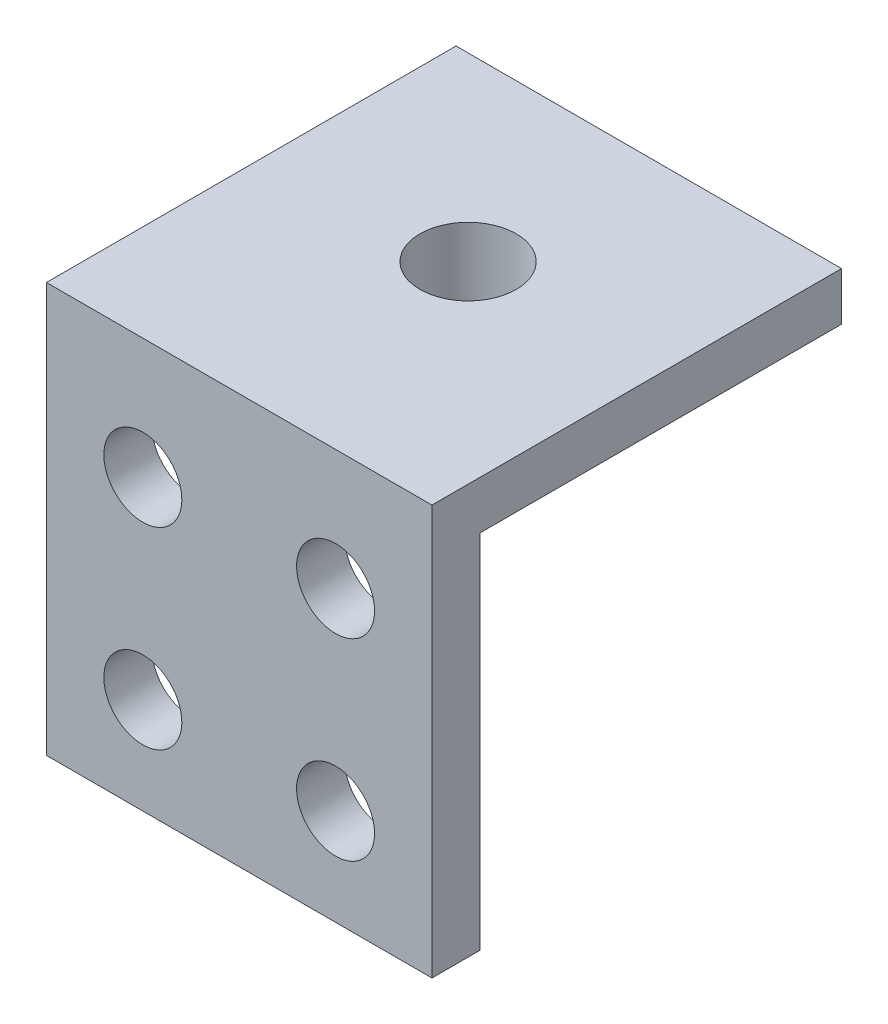
ISO-10303-21;
HEADER;
FILE_DESCRIPTION(('STEP AP214'),'2;1');
FILE_NAME('part.step','',(''),(''),'','','');
FILE_SCHEMA(('AUTOMOTIVE_DESIGN { 1 0 10303 214 1 1 1 1 }'));
ENDSEC;
DATA;
#1=APPLICATION_CONTEXT('core data for automotive mechanical design processes');
#2=APPLICATION_PROTOCOL_DEFINITION('international standard','automotive_design',2000,#1);
#3=PRODUCT_CONTEXT('',#1,'mechanical');
#4=PRODUCT('Part','Part','',(#3));
#5=PRODUCT_RELATED_PRODUCT_CATEGORY('part','',(#4));
#6=PRODUCT_DEFINITION_FORMATION('','',#4);
#7=PRODUCT_DEFINITION_CONTEXT('part definition',#1,'design');
#8=PRODUCT_DEFINITION('design','',#6,#7);
#9=PRODUCT_DEFINITION_SHAPE('','',#8);
#10=(LENGTH_UNIT() NAMED_UNIT(*) SI_UNIT(.MILLI.,.METRE.));
#11=(NAMED_UNIT(*) PLANE_ANGLE_UNIT() SI_UNIT($,.RADIAN.));
#12=(NAMED_UNIT(*) SI_UNIT($,.STERADIAN.) SOLID_ANGLE_UNIT());
#13=UNCERTAINTY_MEASURE_WITH_UNIT(LENGTH_MEASURE(1.E-05),#10,'distance_accuracy_value','');
#14=(GEOMETRIC_REPRESENTATION_CONTEXT(3) GLOBAL_UNCERTAINTY_ASSIGNED_CONTEXT((#13)) GLOBAL_UNIT_ASSIGNED_CONTEXT((#10,
#11,#12)) REPRESENTATION_CONTEXT('',''));
#15=CARTESIAN_POINT('',(0.,0.,0.));
#16=DIRECTION('',(0.,0.,1.));
#17=DIRECTION('',(1.,0.,0.));
#18=AXIS2_PLACEMENT_3D('',#15,#16,#17);
#19=CARTESIAN_POINT('',(-12.7,-1.5875,-1.5875));
#20=DIRECTION('',(0.,-1.,0.));
#21=DIRECTION('',(1.,0.,0.));
#22=AXIS2_PLACEMENT_3D('',#19,#20,#21);
#23=PLANE('',#22);
#24=DIRECTION('',(0.,0.,-1.));
#25=VECTOR('',#24,1.);
#26=CARTESIAN_POINT('',(-12.7,-1.5875,-1.5875));
#27=LINE('',#26,#25);
#28=CARTESIAN_POINT('',(-12.7,-1.5875,-1.5875));
#29=VERTEX_POINT('',#28);
#30=CARTESIAN_POINT('',(-12.7,-1.5875,-25.4));
#31=VERTEX_POINT('',#30);
#32=EDGE_CURVE('E196',#29,#31,#27,.T.);
#33=ORIENTED_EDGE('',*,*,#32,.T.);
#34=DIRECTION('',(1.,0.,0.));
#35=VECTOR('',#34,1.);
#36=CARTESIAN_POINT('',(-12.7,-1.5875,-25.4));
#37=LINE('',#36,#35);
#38=CARTESIAN_POINT('',(12.7,-1.5875,-25.4));
#39=VERTEX_POINT('',#38);
#40=EDGE_CURVE('E12',#31,#39,#37,.T.);
#41=ORIENTED_EDGE('',*,*,#40,.T.);
#42=DIRECTION('',(0.,0.,-1.));
#43=VECTOR('',#42,1.);
#44=CARTESIAN_POINT('',(12.7,-1.5875,-1.5875));
#45=LINE('',#44,#43);
#46=CARTESIAN_POINT('',(12.7,-1.5875,-1.5875));
#47=VERTEX_POINT('',#46);
#48=EDGE_CURVE('E199',#47,#39,#45,.T.);
#49=ORIENTED_EDGE('',*,*,#48,.F.);
#50=DIRECTION('',(-1.,0.,0.));
#51=VECTOR('',#50,1.);
#52=CARTESIAN_POINT('',(-12.7,-1.5875,-1.5875));
#53=LINE('',#52,#51);
#54=EDGE_CURVE('E171',#47,#29,#53,.T.);
#55=ORIENTED_EDGE('',*,*,#54,.T.);
#56=EDGE_LOOP('',(#33,#41,#49,#55));
#57=FACE_BOUND('',#56,.T.);
#58=DIRECTION('',(0.707106781186547,0.,0.707106781186548));
#59=VECTOR('',#58,1.);
#60=CARTESIAN_POINT('',(2.63025612106916,-1.5875,-19.84375));
#61=LINE('',#60,#59);
#62=CARTESIAN_POINT('',(2.63025612106916,-1.5875,-19.84375));
#63=VERTEX_POINT('',#62);
#64=CARTESIAN_POINT('',(6.35,-1.5875,-16.1240061210692));
#65=VERTEX_POINT('',#64);
#66=EDGE_CURVE('E479',#63,#65,#61,.T.);
#67=ORIENTED_EDGE('',*,*,#66,.F.);
#68=DIRECTION('',(1.,0.,0.));
#69=VECTOR('',#68,1.);
#70=CARTESIAN_POINT('',(-2.63025612106915,-1.5875,-19.84375));
#71=LINE('',#70,#69);
#72=CARTESIAN_POINT('',(-2.63025612106915,-1.5875,-19.84375));
#73=VERTEX_POINT('',#72);
#74=EDGE_CURVE('E155',#73,#63,#71,.T.);
#75=ORIENTED_EDGE('',*,*,#74,.F.);
#76=DIRECTION('',(0.707106781186548,0.,-0.707106781186548));
#77=VECTOR('',#76,1.);
#78=CARTESIAN_POINT('',(-6.35,-1.5875,-16.1240061210692));
#79=LINE('',#78,#77);
#80=CARTESIAN_POINT('',(-6.35,-1.5875,-16.1240061210692));
#81=VERTEX_POINT('',#80);
#82=EDGE_CURVE('E151',#81,#73,#79,.T.);
#83=ORIENTED_EDGE('',*,*,#82,.F.);
#84=DIRECTION('',(0.,0.,-1.));
#85=VECTOR('',#84,1.);
#86=CARTESIAN_POINT('',(-6.35,-1.5875,-10.8634938789308));
#87=LINE('',#86,#85);
#88=CARTESIAN_POINT('',(-6.35,-1.5875,-10.8634938789308));
#89=VERTEX_POINT('',#88);
#90=EDGE_CURVE('E489',#89,#81,#87,.T.);
#91=ORIENTED_EDGE('',*,*,#90,.F.);
#92=DIRECTION('',(-0.707106781186547,0.,-0.707106781186548));
#93=VECTOR('',#92,1.);
#94=CARTESIAN_POINT('',(-2.63025612106916,-1.5875,-7.14375));
#95=LINE('',#94,#93);
#96=CARTESIAN_POINT('',(-2.63025612106916,-1.5875,-7.14375));
#97=VERTEX_POINT('',#96);
#98=EDGE_CURVE('E487',#97,#89,#95,.T.);
#99=ORIENTED_EDGE('',*,*,#98,.F.);
#100=DIRECTION('',(-1.,0.,0.));
#101=VECTOR('',#100,1.);
#102=CARTESIAN_POINT('',(2.63025612106914,-1.5875,-7.14374999999999));
#103=LINE('',#102,#101);
#104=CARTESIAN_POINT('',(2.63025612106914,-1.5875,-7.14374999999999));
#105=VERTEX_POINT('',#104);
#106=EDGE_CURVE('E485',#105,#97,#103,.T.);
#107=ORIENTED_EDGE('',*,*,#106,.F.);
#108=DIRECTION('',(-0.707106781186548,0.,0.707106781186547));
#109=VECTOR('',#108,1.);
#110=CARTESIAN_POINT('',(6.35,-1.5875,-10.8634938789308));
#111=LINE('',#110,#109);
#112=CARTESIAN_POINT('',(6.35,-1.5875,-10.8634938789308));
#113=VERTEX_POINT('',#112);
#114=EDGE_CURVE('E483',#113,#105,#111,.T.);
#115=ORIENTED_EDGE('',*,*,#114,.F.);
#116=DIRECTION('',(0.,0.,1.));
#117=VECTOR('',#116,1.);
#118=CARTESIAN_POINT('',(6.35,-1.5875,-16.1240061210692));
#119=LINE('',#118,#117);
#120=EDGE_CURVE('E481',#65,#113,#119,.T.);
#121=ORIENTED_EDGE('',*,*,#120,.F.);
#122=EDGE_LOOP('',(#67,#75,#83,#91,#99,#107,#115,#121));
#123=FACE_BOUND('',#122,.T.);
#124=ADVANCED_FACE('F32',(#57,#123),#23,.T.);
#125=CARTESIAN_POINT('',(-12.7,1.58750000000001,1.5875));
#126=DIRECTION('',(0.,1.,0.));
#127=DIRECTION('',(-1.,0.,0.));
#128=AXIS2_PLACEMENT_3D('',#125,#126,#127);
#129=PLANE('',#128);
#130=CARTESIAN_POINT('',(0.,1.58750000000001,-13.49375));
#131=DIRECTION('',(0.,-1.,0.));
#132=DIRECTION('',(1.,0.,0.));
#133=AXIS2_PLACEMENT_3D('',#130,#131,#132);
#134=CIRCLE('',#133,3.175);
#135=CARTESIAN_POINT('',(3.175,1.58750000000001,-13.49375));
#136=VERTEX_POINT('',#135);
#137=EDGE_CURVE('E463',#136,#136,#134,.T.);
#138=ORIENTED_EDGE('',*,*,#137,.T.);
#139=EDGE_LOOP('',(#138));
#140=FACE_BOUND('',#139,.T.);
#141=DIRECTION('',(0.,0.,-1.));
#142=VECTOR('',#141,1.);
#143=CARTESIAN_POINT('',(12.7,1.5875,1.5875));
#144=LINE('',#143,#142);
#145=CARTESIAN_POINT('',(12.7,1.5875,1.5875));
#146=VERTEX_POINT('',#145);
#147=CARTESIAN_POINT('',(12.7,1.5875,-25.4));
#148=VERTEX_POINT('',#147);
#149=EDGE_CURVE('E201',#146,#148,#144,.T.);
#150=ORIENTED_EDGE('',*,*,#149,.T.);
#151=DIRECTION('',(-1.,0.,0.));
#152=VECTOR('',#151,1.);
#153=CARTESIAN_POINT('',(-12.7,1.58750000000001,-25.4));
#154=LINE('',#153,#152);
#155=CARTESIAN_POINT('',(-12.7,1.58750000000001,-25.4));
#156=VERTEX_POINT('',#155);
#157=EDGE_CURVE('E168',#148,#156,#154,.T.);
#158=ORIENTED_EDGE('',*,*,#157,.T.);
#159=DIRECTION('',(0.,0.,-1.));
#160=VECTOR('',#159,1.);
#161=CARTESIAN_POINT('',(-12.7,1.58750000000001,1.58750000000001));
#162=LINE('',#161,#160);
#163=CARTESIAN_POINT('',(-12.7,1.58750000000001,1.58750000000001));
#164=VERTEX_POINT('',#163);
#165=EDGE_CURVE('E177',#164,#156,#162,.T.);
#166=ORIENTED_EDGE('',*,*,#165,.F.);
#167=DIRECTION('',(1.,0.,0.));
#168=VECTOR('',#167,1.);
#169=CARTESIAN_POINT('',(-12.7,1.58750000000001,1.5875));
#170=LINE('',#169,#168);
#171=EDGE_CURVE('E174',#164,#146,#170,.T.);
#172=ORIENTED_EDGE('',*,*,#171,.T.);
#173=EDGE_LOOP('',(#150,#158,#166,#172));
#174=FACE_BOUND('',#173,.T.);
#175=ADVANCED_FACE('F220',(#140,#174),#129,.T.);
#176=CARTESIAN_POINT('',(-12.7,25.5976683508479,1.58750000000001));
#177=DIRECTION('',(0.,0.,-1.));
#178=DIRECTION('',(0.,1.,0.));
#179=AXIS2_PLACEMENT_3D('',#176,#177,#178);
#180=PLANE('',#179);
#181=CARTESIAN_POINT('',(-6.35,-6.35,1.58750000000001));
#182=DIRECTION('',(0.,0.,-1.));
#183=DIRECTION('',(0.,1.,0.));
#184=AXIS2_PLACEMENT_3D('',#181,#182,#183);
#185=CIRCLE('',#184,2.56951014505216);
#186=CARTESIAN_POINT('',(-6.35,-3.78048985494783,1.58750000000001));
#187=VERTEX_POINT('',#186);
#188=EDGE_CURVE('E437',#187,#187,#185,.T.);
#189=ORIENTED_EDGE('',*,*,#188,.T.);
#190=EDGE_LOOP('',(#189));
#191=FACE_BOUND('',#190,.T.);
#192=CARTESIAN_POINT('',(-6.35,-19.05,1.58750000000001));
#193=DIRECTION('',(0.,0.,-1.));
#194=DIRECTION('',(0.,1.,0.));
#195=AXIS2_PLACEMENT_3D('',#192,#193,#194);
#196=CIRCLE('',#195,2.56951014505216);
#197=CARTESIAN_POINT('',(-6.35,-16.4804898549478,1.58750000000001));
#198=VERTEX_POINT('',#197);
#199=EDGE_CURVE('E445',#198,#198,#196,.T.);
#200=ORIENTED_EDGE('',*,*,#199,.T.);
#201=EDGE_LOOP('',(#200));
#202=FACE_BOUND('',#201,.T.);
#203=CARTESIAN_POINT('',(6.35,-6.35,1.58750000000001));
#204=DIRECTION('',(0.,0.,-1.));
#205=DIRECTION('',(0.,1.,0.));
#206=AXIS2_PLACEMENT_3D('',#203,#204,#205);
#207=CIRCLE('',#206,2.56951014505216);
#208=CARTESIAN_POINT('',(6.35,-3.78048985494783,1.58750000000001));
#209=VERTEX_POINT('',#208);
#210=EDGE_CURVE('E451',#209,#209,#207,.T.);
#211=ORIENTED_EDGE('',*,*,#210,.T.);
#212=EDGE_LOOP('',(#211));
#213=FACE_BOUND('',#212,.T.);
#214=CARTESIAN_POINT('',(6.35,-19.05,1.58750000000001));
#215=DIRECTION('',(0.,0.,-1.));
#216=DIRECTION('',(0.,1.,0.));
#217=AXIS2_PLACEMENT_3D('',#214,#215,#216);
#218=CIRCLE('',#217,2.56951014505216);
#219=CARTESIAN_POINT('',(6.35,-16.4804898549478,1.58750000000001));
#220=VERTEX_POINT('',#219);
#221=EDGE_CURVE('E457',#220,#220,#218,.T.);
#222=ORIENTED_EDGE('',*,*,#221,.T.);
#223=EDGE_LOOP('',(#222));
#224=FACE_BOUND('',#223,.T.);
#225=ORIENTED_EDGE('',*,*,#171,.F.);
#226=DIRECTION('',(0.,-1.,0.));
#227=VECTOR('',#226,1.);
#228=CARTESIAN_POINT('',(-12.7,25.5976683508479,1.58750000000001));
#229=LINE('',#228,#227);
#230=CARTESIAN_POINT('',(-12.7,-25.4,1.5875));
#231=VERTEX_POINT('',#230);
#232=EDGE_CURVE('E189',#164,#231,#229,.T.);
#233=ORIENTED_EDGE('',*,*,#232,.T.);
#234=DIRECTION('',(1.,0.,0.));
#235=VECTOR('',#234,1.);
#236=CARTESIAN_POINT('',(-12.7,-25.4,1.5875));
#237=LINE('',#236,#235);
#238=CARTESIAN_POINT('',(12.7,-25.4,1.5875));
#239=VERTEX_POINT('',#238);
#240=EDGE_CURVE('E184',#231,#239,#237,.T.);
#241=ORIENTED_EDGE('',*,*,#240,.T.);
#242=DIRECTION('',(0.,-1.,0.));
#243=VECTOR('',#242,1.);
#244=CARTESIAN_POINT('',(12.7,25.5976683508479,1.58750000000001));
#245=LINE('',#244,#243);
#246=EDGE_CURVE('E187',#146,#239,#245,.T.);
#247=ORIENTED_EDGE('',*,*,#246,.F.);
#248=EDGE_LOOP('',(#225,#233,#241,#247));
#249=FACE_BOUND('',#248,.T.);
#250=ADVANCED_FACE('F224',(#191,#202,#213,#224,#249),#180,.F.);
#251=CARTESIAN_POINT('',(-12.7,25.5976683508479,1.58750000000001));
#252=DIRECTION('',(1.,0.,0.));
#253=DIRECTION('',(0.,0.,-1.));
#254=AXIS2_PLACEMENT_3D('',#251,#252,#253);
#255=PLANE('',#254);
#256=ORIENTED_EDGE('',*,*,#232,.F.);
#257=ORIENTED_EDGE('',*,*,#165,.T.);
#258=DIRECTION('',(0.,-1.,0.));
#259=VECTOR('',#258,1.);
#260=CARTESIAN_POINT('',(-12.7,13.592584175424,-25.4));
#261=LINE('',#260,#259);
#262=EDGE_CURVE('E40',#156,#31,#261,.T.);
#263=ORIENTED_EDGE('',*,*,#262,.T.);
#264=ORIENTED_EDGE('',*,*,#32,.F.);
#265=DIRECTION('',(0.,-1.,0.));
#266=VECTOR('',#265,1.);
#267=CARTESIAN_POINT('',(-12.7,25.5976683508479,-1.58749999999999));
#268=LINE('',#267,#266);
#269=CARTESIAN_POINT('',(-12.7,-25.4,-1.5875));
#270=VERTEX_POINT('',#269);
#271=EDGE_CURVE('E191',#29,#270,#268,.T.);
#272=ORIENTED_EDGE('',*,*,#271,.T.);
#273=DIRECTION('',(0.,0.,1.));
#274=VECTOR('',#273,1.);
#275=CARTESIAN_POINT('',(-12.7,-25.4,1.5875));
#276=LINE('',#275,#274);
#277=EDGE_CURVE('E181',#270,#231,#276,.T.);
#278=ORIENTED_EDGE('',*,*,#277,.T.);
#279=EDGE_LOOP('',(#256,#257,#263,#264,#272,#278));
#280=FACE_BOUND('',#279,.T.);
#281=ADVANCED_FACE('F217',(#280),#255,.F.);
#282=CARTESIAN_POINT('',(-12.7,25.5976683508479,-1.58749999999999));
#283=DIRECTION('',(0.,0.,1.));
#284=DIRECTION('',(0.,-1.,0.));
#285=AXIS2_PLACEMENT_3D('',#282,#283,#284);
#286=PLANE('',#285);
#287=CARTESIAN_POINT('',(-6.35,-6.35,-1.5875));
#288=DIRECTION('',(0.,0.,-1.));
#289=DIRECTION('',(0.,1.,0.));
#290=AXIS2_PLACEMENT_3D('',#287,#288,#289);
#291=CIRCLE('',#290,2.56951014505216);
#292=CARTESIAN_POINT('',(-6.35,-3.78048985494783,-1.5875));
#293=VERTEX_POINT('',#292);
#294=EDGE_CURVE('E440',#293,#293,#291,.T.);
#295=ORIENTED_EDGE('',*,*,#294,.F.);
#296=EDGE_LOOP('',(#295));
#297=FACE_BOUND('',#296,.T.);
#298=CARTESIAN_POINT('',(-6.35,-19.05,-1.5875));
#299=DIRECTION('',(0.,0.,-1.));
#300=DIRECTION('',(0.,1.,0.));
#301=AXIS2_PLACEMENT_3D('',#298,#299,#300);
#302=CIRCLE('',#301,2.56951014505216);
#303=CARTESIAN_POINT('',(-6.35,-16.4804898549478,-1.5875));
#304=VERTEX_POINT('',#303);
#305=EDGE_CURVE('E442',#304,#304,#302,.T.);
#306=ORIENTED_EDGE('',*,*,#305,.F.);
#307=EDGE_LOOP('',(#306));
#308=FACE_BOUND('',#307,.T.);
#309=CARTESIAN_POINT('',(6.35,-6.35,-1.5875));
#310=DIRECTION('',(0.,0.,-1.));
#311=DIRECTION('',(0.,1.,0.));
#312=AXIS2_PLACEMENT_3D('',#309,#310,#311);
#313=CIRCLE('',#312,2.56951014505216);
#314=CARTESIAN_POINT('',(6.35,-3.78048985494783,-1.5875));
#315=VERTEX_POINT('',#314);
#316=EDGE_CURVE('E448',#315,#315,#313,.T.);
#317=ORIENTED_EDGE('',*,*,#316,.F.);
#318=EDGE_LOOP('',(#317));
#319=FACE_BOUND('',#318,.T.);
#320=CARTESIAN_POINT('',(6.35,-19.05,-1.5875));
#321=DIRECTION('',(0.,0.,-1.));
#322=DIRECTION('',(0.,1.,0.));
#323=AXIS2_PLACEMENT_3D('',#320,#321,#322);
#324=CIRCLE('',#323,2.56951014505216);
#325=CARTESIAN_POINT('',(6.35,-16.4804898549478,-1.5875));
#326=VERTEX_POINT('',#325);
#327=EDGE_CURVE('E454',#326,#326,#324,.T.);
#328=ORIENTED_EDGE('',*,*,#327,.F.);
#329=EDGE_LOOP('',(#328));
#330=FACE_BOUND('',#329,.T.);
#331=ORIENTED_EDGE('',*,*,#54,.F.);
#332=DIRECTION('',(0.,-1.,0.));
#333=VECTOR('',#332,1.);
#334=CARTESIAN_POINT('',(12.7,25.5976683508479,-1.5875));
#335=LINE('',#334,#333);
#336=CARTESIAN_POINT('',(12.7,-25.4,-1.5875));
#337=VERTEX_POINT('',#336);
#338=EDGE_CURVE('E175',#47,#337,#335,.T.);
#339=ORIENTED_EDGE('',*,*,#338,.T.);
#340=DIRECTION('',(-1.,0.,0.));
#341=VECTOR('',#340,1.);
#342=CARTESIAN_POINT('',(-12.7,-25.4,-1.5875));
#343=LINE('',#342,#341);
#344=EDGE_CURVE('E160',#337,#270,#343,.T.);
#345=ORIENTED_EDGE('',*,*,#344,.T.);
#346=ORIENTED_EDGE('',*,*,#271,.F.);
#347=EDGE_LOOP('',(#331,#339,#345,#346));
#348=FACE_BOUND('',#347,.T.);
#349=ADVANCED_FACE('F212',(#297,#308,#319,#330,#348),#286,.F.);
#350=CARTESIAN_POINT('',(12.7,25.5976683508479,1.58750000000001));
#351=DIRECTION('',(-1.,0.,0.));
#352=DIRECTION('',(0.,0.,1.));
#353=AXIS2_PLACEMENT_3D('',#350,#351,#352);
#354=PLANE('',#353);
#355=ORIENTED_EDGE('',*,*,#338,.F.);
#356=ORIENTED_EDGE('',*,*,#48,.T.);
#357=DIRECTION('',(0.,1.,0.));
#358=VECTOR('',#357,1.);
#359=CARTESIAN_POINT('',(12.7,13.592584175424,-25.4));
#360=LINE('',#359,#358);
#361=EDGE_CURVE('E35',#39,#148,#360,.T.);
#362=ORIENTED_EDGE('',*,*,#361,.T.);
#363=ORIENTED_EDGE('',*,*,#149,.F.);
#364=ORIENTED_EDGE('',*,*,#246,.T.);
#365=DIRECTION('',(0.,0.,-1.));
#366=VECTOR('',#365,1.);
#367=CARTESIAN_POINT('',(12.7,-25.4,1.5875));
#368=LINE('',#367,#366);
#369=EDGE_CURVE('E157',#239,#337,#368,.T.);
#370=ORIENTED_EDGE('',*,*,#369,.T.);
#371=EDGE_LOOP('',(#355,#356,#362,#363,#364,#370));
#372=FACE_BOUND('',#371,.T.);
#373=ADVANCED_FACE('F206',(#372),#354,.F.);
#374=CARTESIAN_POINT('',(12.7,-25.4,-1.5875));
#375=DIRECTION('',(0.,-1.,0.));
#376=DIRECTION('',(0.,0.,-1.));
#377=AXIS2_PLACEMENT_3D('',#374,#375,#376);
#378=PLANE('',#377);
#379=ORIENTED_EDGE('',*,*,#369,.F.);
#380=ORIENTED_EDGE('',*,*,#240,.F.);
#381=ORIENTED_EDGE('',*,*,#277,.F.);
#382=ORIENTED_EDGE('',*,*,#344,.F.);
#383=EDGE_LOOP('',(#379,#380,#381,#382));
#384=FACE_BOUND('',#383,.T.);
#385=ADVANCED_FACE('F227',(#384),#378,.T.);
#386=CARTESIAN_POINT('',(0.,0.,-25.4));
#387=DIRECTION('',(0.,0.,-1.));
#388=DIRECTION('',(-1.,0.,0.));
#389=AXIS2_PLACEMENT_3D('',#386,#387,#388);
#390=PLANE('',#389);
#391=ORIENTED_EDGE('',*,*,#361,.F.);
#392=ORIENTED_EDGE('',*,*,#40,.F.);
#393=ORIENTED_EDGE('',*,*,#262,.F.);
#394=ORIENTED_EDGE('',*,*,#157,.F.);
#395=EDGE_LOOP('',(#391,#392,#393,#394));
#396=FACE_BOUND('',#395,.T.);
#397=ADVANCED_FACE('F219',(#396),#390,.T.);
#398=CARTESIAN_POINT('',(-2.63025612106915,-7.9375,-19.84375));
#399=DIRECTION('',(0.,0.,1.));
#400=DIRECTION('',(1.,0.,0.));
#401=AXIS2_PLACEMENT_3D('',#398,#399,#400);
#402=PLANE('',#401);
#403=ORIENTED_EDGE('',*,*,#74,.T.);
#404=DIRECTION('',(0.,1.,0.));
#405=VECTOR('',#404,1.);
#406=CARTESIAN_POINT('',(2.63025612106916,-7.9375,-19.84375));
#407=LINE('',#406,#405);
#408=CARTESIAN_POINT('',(2.63025612106916,-7.9375,-19.84375));
#409=VERTEX_POINT('',#408);
#410=EDGE_CURVE('E136',#409,#63,#407,.T.);
#411=ORIENTED_EDGE('',*,*,#410,.F.);
#412=DIRECTION('',(1.,0.,0.));
#413=VECTOR('',#412,1.);
#414=CARTESIAN_POINT('',(-2.63025612106915,-7.9375,-19.84375));
#415=LINE('',#414,#413);
#416=CARTESIAN_POINT('',(-2.63025612106915,-7.9375,-19.84375));
#417=VERTEX_POINT('',#416);
#418=EDGE_CURVE('E143',#417,#409,#415,.T.);
#419=ORIENTED_EDGE('',*,*,#418,.F.);
#420=DIRECTION('',(0.,1.,0.));
#421=VECTOR('',#420,1.);
#422=CARTESIAN_POINT('',(-2.63025612106915,-7.9375,-19.84375));
#423=LINE('',#422,#421);
#424=EDGE_CURVE('E477',#417,#73,#423,.T.);
#425=ORIENTED_EDGE('',*,*,#424,.T.);
#426=EDGE_LOOP('',(#403,#411,#419,#425));
#427=FACE_BOUND('',#426,.T.);
#428=ADVANCED_FACE('F153',(#427),#402,.F.);
#429=CARTESIAN_POINT('',(2.63025612106916,-7.9375,-19.84375));
#430=DIRECTION('',(-0.707106781186548,0.,0.707106781186547));
#431=DIRECTION('',(0.707106781186547,0.,0.707106781186548));
#432=AXIS2_PLACEMENT_3D('',#429,#430,#431);
#433=PLANE('',#432);
#434=ORIENTED_EDGE('',*,*,#66,.T.);
#435=DIRECTION('',(0.,1.,0.));
#436=VECTOR('',#435,1.);
#437=CARTESIAN_POINT('',(6.35,-7.9375,-16.1240061210692));
#438=LINE('',#437,#436);
#439=CARTESIAN_POINT('',(6.35,-7.9375,-16.1240061210692));
#440=VERTEX_POINT('',#439);
#441=EDGE_CURVE('E139',#440,#65,#438,.T.);
#442=ORIENTED_EDGE('',*,*,#441,.F.);
#443=DIRECTION('',(0.707106781186547,0.,0.707106781186548));
#444=VECTOR('',#443,1.);
#445=CARTESIAN_POINT('',(2.63025612106916,-7.9375,-19.84375));
#446=LINE('',#445,#444);
#447=EDGE_CURVE('E132',#409,#440,#446,.T.);
#448=ORIENTED_EDGE('',*,*,#447,.F.);
#449=ORIENTED_EDGE('',*,*,#410,.T.);
#450=EDGE_LOOP('',(#434,#442,#448,#449));
#451=FACE_BOUND('',#450,.T.);
#452=ADVANCED_FACE('F134',(#451),#433,.F.);
#453=CARTESIAN_POINT('',(6.35,-7.9375,-16.1240061210692));
#454=DIRECTION('',(-1.,0.,0.));
#455=DIRECTION('',(0.,0.,1.));
#456=AXIS2_PLACEMENT_3D('',#453,#454,#455);
#457=PLANE('',#456);
#458=ORIENTED_EDGE('',*,*,#120,.T.);
#459=DIRECTION('',(0.,1.,0.));
#460=VECTOR('',#459,1.);
#461=CARTESIAN_POINT('',(6.35,-7.9375,-10.8634938789308));
#462=LINE('',#461,#460);
#463=CARTESIAN_POINT('',(6.35,-7.9375,-10.8634938789308));
#464=VERTEX_POINT('',#463);
#465=EDGE_CURVE('E162',#464,#113,#462,.T.);
#466=ORIENTED_EDGE('',*,*,#465,.F.);
#467=DIRECTION('',(0.,0.,1.));
#468=VECTOR('',#467,1.);
#469=CARTESIAN_POINT('',(6.35,-7.9375,-16.1240061210692));
#470=LINE('',#469,#468);
#471=EDGE_CURVE('E142',#440,#464,#470,.T.);
#472=ORIENTED_EDGE('',*,*,#471,.F.);
#473=ORIENTED_EDGE('',*,*,#441,.T.);
#474=EDGE_LOOP('',(#458,#466,#472,#473));
#475=FACE_BOUND('',#474,.T.);
#476=ADVANCED_FACE('F297',(#475),#457,.F.);
#477=CARTESIAN_POINT('',(6.35,-7.9375,-10.8634938789308));
#478=DIRECTION('',(-0.707106781186547,0.,-0.707106781186548));
#479=DIRECTION('',(-0.707106781186548,0.,0.707106781186547));
#480=AXIS2_PLACEMENT_3D('',#477,#478,#479);
#481=PLANE('',#480);
#482=ORIENTED_EDGE('',*,*,#114,.T.);
#483=DIRECTION('',(0.,1.,0.));
#484=VECTOR('',#483,1.);
#485=CARTESIAN_POINT('',(2.63025612106914,-7.9375,-7.14374999999999));
#486=LINE('',#485,#484);
#487=CARTESIAN_POINT('',(2.63025612106914,-7.9375,-7.14374999999999));
#488=VERTEX_POINT('',#487);
#489=EDGE_CURVE('E500',#488,#105,#486,.T.);
#490=ORIENTED_EDGE('',*,*,#489,.F.);
#491=DIRECTION('',(-0.707106781186548,0.,0.707106781186547));
#492=VECTOR('',#491,1.);
#493=CARTESIAN_POINT('',(6.35,-7.9375,-10.8634938789308));
#494=LINE('',#493,#492);
#495=EDGE_CURVE('E468',#464,#488,#494,.T.);
#496=ORIENTED_EDGE('',*,*,#495,.F.);
#497=ORIENTED_EDGE('',*,*,#465,.T.);
#498=EDGE_LOOP('',(#482,#490,#496,#497));
#499=FACE_BOUND('',#498,.T.);
#500=ADVANCED_FACE('F306',(#499),#481,.F.);
#501=CARTESIAN_POINT('',(2.63025612106914,-7.9375,-7.14374999999999));
#502=DIRECTION('',(0.,0.,-1.));
#503=DIRECTION('',(-1.,0.,0.));
#504=AXIS2_PLACEMENT_3D('',#501,#502,#503);
#505=PLANE('',#504);
#506=ORIENTED_EDGE('',*,*,#106,.T.);
#507=DIRECTION('',(0.,1.,0.));
#508=VECTOR('',#507,1.);
#509=CARTESIAN_POINT('',(-2.63025612106916,-7.9375,-7.14375));
#510=LINE('',#509,#508);
#511=CARTESIAN_POINT('',(-2.63025612106916,-7.9375,-7.14375));
#512=VERTEX_POINT('',#511);
#513=EDGE_CURVE('E497',#512,#97,#510,.T.);
#514=ORIENTED_EDGE('',*,*,#513,.F.);
#515=DIRECTION('',(-1.,0.,0.));
#516=VECTOR('',#515,1.);
#517=CARTESIAN_POINT('',(2.63025612106914,-7.9375,-7.14374999999999));
#518=LINE('',#517,#516);
#519=EDGE_CURVE('E470',#488,#512,#518,.T.);
#520=ORIENTED_EDGE('',*,*,#519,.F.);
#521=ORIENTED_EDGE('',*,*,#489,.T.);
#522=EDGE_LOOP('',(#506,#514,#520,#521));
#523=FACE_BOUND('',#522,.T.);
#524=ADVANCED_FACE('F316',(#523),#505,.F.);
#525=CARTESIAN_POINT('',(-2.63025612106916,-7.9375,-7.14375));
#526=DIRECTION('',(0.707106781186548,0.,-0.707106781186547));
#527=DIRECTION('',(-0.707106781186547,0.,-0.707106781186548));
#528=AXIS2_PLACEMENT_3D('',#525,#526,#527);
#529=PLANE('',#528);
#530=ORIENTED_EDGE('',*,*,#98,.T.);
#531=DIRECTION('',(0.,1.,0.));
#532=VECTOR('',#531,1.);
#533=CARTESIAN_POINT('',(-6.35,-7.9375,-10.8634938789308));
#534=LINE('',#533,#532);
#535=CARTESIAN_POINT('',(-6.35,-7.9375,-10.8634938789308));
#536=VERTEX_POINT('',#535);
#537=EDGE_CURVE('E494',#536,#89,#534,.T.);
#538=ORIENTED_EDGE('',*,*,#537,.F.);
#539=DIRECTION('',(-0.707106781186547,0.,-0.707106781186548));
#540=VECTOR('',#539,1.);
#541=CARTESIAN_POINT('',(-2.63025612106916,-7.9375,-7.14375));
#542=LINE('',#541,#540);
#543=EDGE_CURVE('E472',#512,#536,#542,.T.);
#544=ORIENTED_EDGE('',*,*,#543,.F.);
#545=ORIENTED_EDGE('',*,*,#513,.T.);
#546=EDGE_LOOP('',(#530,#538,#544,#545));
#547=FACE_BOUND('',#546,.T.);
#548=ADVANCED_FACE('F326',(#547),#529,.F.);
#549=CARTESIAN_POINT('',(-6.35,-7.9375,-10.8634938789308));
#550=DIRECTION('',(1.,0.,0.));
#551=DIRECTION('',(0.,0.,-1.));
#552=AXIS2_PLACEMENT_3D('',#549,#550,#551);
#553=PLANE('',#552);
#554=ORIENTED_EDGE('',*,*,#90,.T.);
#555=DIRECTION('',(0.,1.,0.));
#556=VECTOR('',#555,1.);
#557=CARTESIAN_POINT('',(-6.35,-7.9375,-16.1240061210692));
#558=LINE('',#557,#556);
#559=CARTESIAN_POINT('',(-6.35,-7.9375,-16.1240061210692));
#560=VERTEX_POINT('',#559);
#561=EDGE_CURVE('E48',#560,#81,#558,.T.);
#562=ORIENTED_EDGE('',*,*,#561,.F.);
#563=DIRECTION('',(0.,0.,-1.));
#564=VECTOR('',#563,1.);
#565=CARTESIAN_POINT('',(-6.35,-7.9375,-10.8634938789308));
#566=LINE('',#565,#564);
#567=EDGE_CURVE('E474',#536,#560,#566,.T.);
#568=ORIENTED_EDGE('',*,*,#567,.F.);
#569=ORIENTED_EDGE('',*,*,#537,.T.);
#570=EDGE_LOOP('',(#554,#562,#568,#569));
#571=FACE_BOUND('',#570,.T.);
#572=ADVANCED_FACE('F336',(#571),#553,.F.);
#573=CARTESIAN_POINT('',(-6.35,-7.9375,-16.1240061210692));
#574=DIRECTION('',(0.707106781186548,0.,0.707106781186548));
#575=DIRECTION('',(0.707106781186548,0.,-0.707106781186548));
#576=AXIS2_PLACEMENT_3D('',#573,#574,#575);
#577=PLANE('',#576);
#578=ORIENTED_EDGE('',*,*,#82,.T.);
#579=ORIENTED_EDGE('',*,*,#424,.F.);
#580=DIRECTION('',(0.707106781186548,0.,-0.707106781186548));
#581=VECTOR('',#580,1.);
#582=CARTESIAN_POINT('',(-6.35,-7.9375,-16.1240061210692));
#583=LINE('',#582,#581);
#584=EDGE_CURVE('E147',#560,#417,#583,.T.);
#585=ORIENTED_EDGE('',*,*,#584,.F.);
#586=ORIENTED_EDGE('',*,*,#561,.T.);
#587=EDGE_LOOP('',(#578,#579,#585,#586));
#588=FACE_BOUND('',#587,.T.);
#589=ADVANCED_FACE('F346',(#588),#577,.F.);
#590=CARTESIAN_POINT('',(6.35,-7.9375,-19.84375));
#591=DIRECTION('',(0.,-1.,0.));
#592=DIRECTION('',(1.,0.,0.));
#593=AXIS2_PLACEMENT_3D('',#590,#591,#592);
#594=PLANE('',#593);
#595=CARTESIAN_POINT('',(0.,-7.9375,-13.49375));
#596=DIRECTION('',(0.,-1.,0.));
#597=DIRECTION('',(1.,0.,0.));
#598=AXIS2_PLACEMENT_3D('',#595,#596,#597);
#599=CIRCLE('',#598,3.175);
#600=CARTESIAN_POINT('',(3.175,-7.9375,-13.49375));
#601=VERTEX_POINT('',#600);
#602=EDGE_CURVE('E460',#601,#601,#599,.T.);
#603=ORIENTED_EDGE('',*,*,#602,.F.);
#604=EDGE_LOOP('',(#603));
#605=FACE_BOUND('',#604,.T.);
#606=ORIENTED_EDGE('',*,*,#418,.T.);
#607=ORIENTED_EDGE('',*,*,#447,.T.);
#608=ORIENTED_EDGE('',*,*,#471,.T.);
#609=ORIENTED_EDGE('',*,*,#495,.T.);
#610=ORIENTED_EDGE('',*,*,#519,.T.);
#611=ORIENTED_EDGE('',*,*,#543,.T.);
#612=ORIENTED_EDGE('',*,*,#567,.T.);
#613=ORIENTED_EDGE('',*,*,#584,.T.);
#614=EDGE_LOOP('',(#606,#607,#608,#609,#610,#611,#612,#613));
#615=FACE_BOUND('',#614,.T.);
#616=ADVANCED_FACE('F146',(#605,#615),#594,.T.);
#617=CARTESIAN_POINT('',(0.,1.58750000000001,-13.49375));
#618=DIRECTION('',(0.,-1.,0.));
#619=DIRECTION('',(1.,0.,0.));
#620=AXIS2_PLACEMENT_3D('',#617,#618,#619);
#621=CYLINDRICAL_SURFACE('',#620,3.175);
#622=ORIENTED_EDGE('',*,*,#137,.F.);
#623=EDGE_LOOP('',(#622));
#624=FACE_BOUND('',#623,.T.);
#625=ORIENTED_EDGE('',*,*,#602,.T.);
#626=EDGE_LOOP('',(#625));
#627=FACE_BOUND('',#626,.T.);
#628=ADVANCED_FACE('F369',(#624,#627),#621,.F.);
#629=CARTESIAN_POINT('',(6.35,-19.05,1.58750000000001));
#630=DIRECTION('',(0.,0.,-1.));
#631=DIRECTION('',(0.,1.,0.));
#632=AXIS2_PLACEMENT_3D('',#629,#630,#631);
#633=CYLINDRICAL_SURFACE('',#632,2.56951014505216);
#634=ORIENTED_EDGE('',*,*,#221,.F.);
#635=EDGE_LOOP('',(#634));
#636=FACE_BOUND('',#635,.T.);
#637=ORIENTED_EDGE('',*,*,#327,.T.);
#638=EDGE_LOOP('',(#637));
#639=FACE_BOUND('',#638,.T.);
#640=ADVANCED_FACE('F378',(#636,#639),#633,.F.);
#641=CARTESIAN_POINT('',(6.35,-6.35,1.58750000000001));
#642=DIRECTION('',(0.,0.,-1.));
#643=DIRECTION('',(0.,1.,0.));
#644=AXIS2_PLACEMENT_3D('',#641,#642,#643);
#645=CYLINDRICAL_SURFACE('',#644,2.56951014505216);
#646=ORIENTED_EDGE('',*,*,#210,.F.);
#647=EDGE_LOOP('',(#646));
#648=FACE_BOUND('',#647,.T.);
#649=ORIENTED_EDGE('',*,*,#316,.T.);
#650=EDGE_LOOP('',(#649));
#651=FACE_BOUND('',#650,.T.);
#652=ADVANCED_FACE('F400',(#648,#651),#645,.F.);
#653=CARTESIAN_POINT('',(-6.35,-19.05,1.58750000000001));
#654=DIRECTION('',(0.,0.,-1.));
#655=DIRECTION('',(0.,1.,0.));
#656=AXIS2_PLACEMENT_3D('',#653,#654,#655);
#657=CYLINDRICAL_SURFACE('',#656,2.56951014505216);
#658=ORIENTED_EDGE('',*,*,#199,.F.);
#659=EDGE_LOOP('',(#658));
#660=FACE_BOUND('',#659,.T.);
#661=ORIENTED_EDGE('',*,*,#305,.T.);
#662=EDGE_LOOP('',(#661));
#663=FACE_BOUND('',#662,.T.);
#664=ADVANCED_FACE('F407',(#660,#663),#657,.F.);
#665=CARTESIAN_POINT('',(-6.35,-6.35,1.58750000000001));
#666=DIRECTION('',(0.,0.,-1.));
#667=DIRECTION('',(0.,1.,0.));
#668=AXIS2_PLACEMENT_3D('',#665,#666,#667);
#669=CYLINDRICAL_SURFACE('',#668,2.56951014505216);
#670=ORIENTED_EDGE('',*,*,#188,.F.);
#671=EDGE_LOOP('',(#670));
#672=FACE_BOUND('',#671,.T.);
#673=ORIENTED_EDGE('',*,*,#294,.T.);
#674=EDGE_LOOP('',(#673));
#675=FACE_BOUND('',#674,.T.);
#676=ADVANCED_FACE('F415',(#672,#675),#669,.F.);
#677=CLOSED_SHELL('',(#124,#175,#250,#281,#349,#373,#385,#397,#428,#452,#476,#500,#524,#548,
#572,#589,#616,#628,#640,#652,#664,#676));
#678=MANIFOLD_SOLID_BREP('B2',#677);
#679=ADVANCED_BREP_SHAPE_REPRESENTATION('',(#18,#678),#14);
#680=SHAPE_DEFINITION_REPRESENTATION(#9,#679);
ENDSEC;
END-ISO-10303-21;
